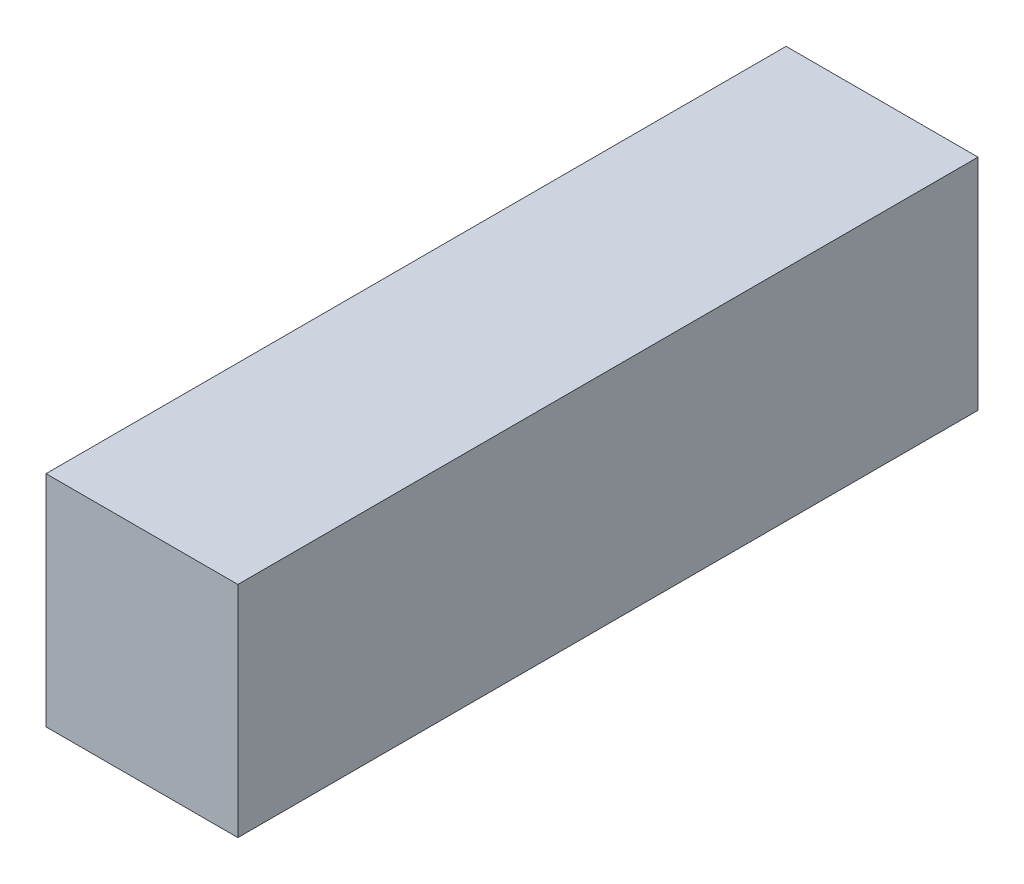
ISO-10303-21;
HEADER;
FILE_DESCRIPTION(('STEP AP214'),'2;1');
FILE_NAME('part.step','',(''),(''),'','','');
FILE_SCHEMA(('AUTOMOTIVE_DESIGN { 1 0 10303 214 1 1 1 1 }'));
ENDSEC;
DATA;
#1=APPLICATION_CONTEXT('core data for automotive mechanical design processes');
#2=APPLICATION_PROTOCOL_DEFINITION('international standard','automotive_design',2000,#1);
#3=PRODUCT_CONTEXT('',#1,'mechanical');
#4=PRODUCT('Part','Part','',(#3));
#5=PRODUCT_RELATED_PRODUCT_CATEGORY('part','',(#4));
#6=PRODUCT_DEFINITION_FORMATION('','',#4);
#7=PRODUCT_DEFINITION_CONTEXT('part definition',#1,'design');
#8=PRODUCT_DEFINITION('design','',#6,#7);
#9=PRODUCT_DEFINITION_SHAPE('','',#8);
#10=(LENGTH_UNIT() NAMED_UNIT(*) SI_UNIT(.MILLI.,.METRE.));
#11=(NAMED_UNIT(*) PLANE_ANGLE_UNIT() SI_UNIT($,.RADIAN.));
#12=(NAMED_UNIT(*) SI_UNIT($,.STERADIAN.) SOLID_ANGLE_UNIT());
#13=UNCERTAINTY_MEASURE_WITH_UNIT(LENGTH_MEASURE(1.E-05),#10,'distance_accuracy_value','');
#14=(GEOMETRIC_REPRESENTATION_CONTEXT(3) GLOBAL_UNCERTAINTY_ASSIGNED_CONTEXT((#13)) GLOBAL_UNIT_ASSIGNED_CONTEXT((#10,
#11,#12)) REPRESENTATION_CONTEXT('',''));
#15=CARTESIAN_POINT('',(0.,0.,0.));
#16=DIRECTION('',(0.,0.,1.));
#17=DIRECTION('',(1.,0.,0.));
#18=AXIS2_PLACEMENT_3D('',#15,#16,#17);
#19=CARTESIAN_POINT('',(8.5,-4.,-75.6));
#20=DIRECTION('',(0.,0.,1.));
#21=DIRECTION('',(1.,0.,0.));
#22=AXIS2_PLACEMENT_3D('',#19,#20,#21);
#23=PLANE('',#22);
#24=DIRECTION('',(0.,1.,0.));
#25=VECTOR('',#24,1.);
#26=CARTESIAN_POINT('',(8.5,-4.,-75.6));
#27=LINE('',#26,#25);
#28=CARTESIAN_POINT('',(8.5,-4.,-75.6));
#29=VERTEX_POINT('',#28);
#30=CARTESIAN_POINT('',(8.5,4.,-75.6));
#31=VERTEX_POINT('',#30);
#32=EDGE_CURVE('E87',#29,#31,#27,.T.);
#33=ORIENTED_EDGE('',*,*,#32,.F.);
#34=DIRECTION('',(1.,0.,0.));
#35=VECTOR('',#34,1.);
#36=CARTESIAN_POINT('',(8.5,-4.,-75.6));
#37=LINE('',#36,#35);
#38=CARTESIAN_POINT('',(15.5,-4.,-75.6));
#39=VERTEX_POINT('',#38);
#40=EDGE_CURVE('E67',#29,#39,#37,.T.);
#41=ORIENTED_EDGE('',*,*,#40,.T.);
#42=DIRECTION('',(0.,1.,0.));
#43=VECTOR('',#42,1.);
#44=CARTESIAN_POINT('',(15.5,-4.,-75.6));
#45=LINE('',#44,#43);
#46=CARTESIAN_POINT('',(15.5,4.,-75.6));
#47=VERTEX_POINT('',#46);
#48=EDGE_CURVE('E81',#39,#47,#45,.T.);
#49=ORIENTED_EDGE('',*,*,#48,.T.);
#50=DIRECTION('',(1.,0.,0.));
#51=VECTOR('',#50,1.);
#52=CARTESIAN_POINT('',(8.5,4.,-75.6));
#53=LINE('',#52,#51);
#54=EDGE_CURVE('E9',#31,#47,#53,.T.);
#55=ORIENTED_EDGE('',*,*,#54,.F.);
#56=EDGE_LOOP('',(#33,#41,#49,#55));
#57=FACE_BOUND('',#56,.T.);
#58=ADVANCED_FACE('F15',(#57),#23,.T.);
#59=CARTESIAN_POINT('',(8.5,-4.,-102.6));
#60=DIRECTION('',(0.,0.,1.));
#61=DIRECTION('',(1.,0.,0.));
#62=AXIS2_PLACEMENT_3D('',#59,#60,#61);
#63=PLANE('',#62);
#64=DIRECTION('',(1.,0.,0.));
#65=VECTOR('',#64,1.);
#66=CARTESIAN_POINT('',(8.5,4.,-102.6));
#67=LINE('',#66,#65);
#68=CARTESIAN_POINT('',(8.5,4.,-102.6));
#69=VERTEX_POINT('',#68);
#70=CARTESIAN_POINT('',(15.5,4.,-102.6));
#71=VERTEX_POINT('',#70);
#72=EDGE_CURVE('E18',#69,#71,#67,.T.);
#73=ORIENTED_EDGE('',*,*,#72,.T.);
#74=DIRECTION('',(0.,1.,0.));
#75=VECTOR('',#74,1.);
#76=CARTESIAN_POINT('',(15.5,-4.,-102.6));
#77=LINE('',#76,#75);
#78=CARTESIAN_POINT('',(15.5,-4.,-102.6));
#79=VERTEX_POINT('',#78);
#80=EDGE_CURVE('E105',#79,#71,#77,.T.);
#81=ORIENTED_EDGE('',*,*,#80,.F.);
#82=DIRECTION('',(1.,0.,0.));
#83=VECTOR('',#82,1.);
#84=CARTESIAN_POINT('',(8.5,-4.,-102.6));
#85=LINE('',#84,#83);
#86=CARTESIAN_POINT('',(8.5,-4.,-102.6));
#87=VERTEX_POINT('',#86);
#88=EDGE_CURVE('E79',#87,#79,#85,.T.);
#89=ORIENTED_EDGE('',*,*,#88,.F.);
#90=DIRECTION('',(0.,1.,0.));
#91=VECTOR('',#90,1.);
#92=CARTESIAN_POINT('',(8.5,-4.,-102.6));
#93=LINE('',#92,#91);
#94=EDGE_CURVE('E86',#87,#69,#93,.T.);
#95=ORIENTED_EDGE('',*,*,#94,.T.);
#96=EDGE_LOOP('',(#73,#81,#89,#95));
#97=FACE_BOUND('',#96,.T.);
#98=ADVANCED_FACE('F128',(#97),#63,.F.);
#99=CARTESIAN_POINT('',(8.5,4.,-102.6));
#100=DIRECTION('',(0.,1.,0.));
#101=DIRECTION('',(1.,0.,0.));
#102=AXIS2_PLACEMENT_3D('',#99,#100,#101);
#103=PLANE('',#102);
#104=ORIENTED_EDGE('',*,*,#72,.F.);
#105=DIRECTION('',(0.,0.,1.));
#106=VECTOR('',#105,1.);
#107=CARTESIAN_POINT('',(8.5,4.,-102.6));
#108=LINE('',#107,#106);
#109=EDGE_CURVE('E95',#69,#31,#108,.T.);
#110=ORIENTED_EDGE('',*,*,#109,.T.);
#111=ORIENTED_EDGE('',*,*,#54,.T.);
#112=DIRECTION('',(0.,0.,1.));
#113=VECTOR('',#112,1.);
#114=CARTESIAN_POINT('',(15.5,4.,-102.6));
#115=LINE('',#114,#113);
#116=EDGE_CURVE('E106',#71,#47,#115,.T.);
#117=ORIENTED_EDGE('',*,*,#116,.F.);
#118=EDGE_LOOP('',(#104,#110,#111,#117));
#119=FACE_BOUND('',#118,.T.);
#120=ADVANCED_FACE('F132',(#119),#103,.T.);
#121=CARTESIAN_POINT('',(8.5,-4.,-102.6));
#122=DIRECTION('',(0.,1.,0.));
#123=DIRECTION('',(1.,0.,0.));
#124=AXIS2_PLACEMENT_3D('',#121,#122,#123);
#125=PLANE('',#124);
#126=DIRECTION('',(0.,0.,1.));
#127=VECTOR('',#126,1.);
#128=CARTESIAN_POINT('',(15.5,-4.,-102.6));
#129=LINE('',#128,#127);
#130=EDGE_CURVE('E74',#79,#39,#129,.T.);
#131=ORIENTED_EDGE('',*,*,#130,.T.);
#132=ORIENTED_EDGE('',*,*,#40,.F.);
#133=DIRECTION('',(0.,0.,1.));
#134=VECTOR('',#133,1.);
#135=CARTESIAN_POINT('',(8.5,-4.,-102.6));
#136=LINE('',#135,#134);
#137=EDGE_CURVE('E71',#87,#29,#136,.T.);
#138=ORIENTED_EDGE('',*,*,#137,.F.);
#139=ORIENTED_EDGE('',*,*,#88,.T.);
#140=EDGE_LOOP('',(#131,#132,#138,#139));
#141=FACE_BOUND('',#140,.T.);
#142=ADVANCED_FACE('F75',(#141),#125,.F.);
#143=CARTESIAN_POINT('',(15.5,-4.,-102.6));
#144=DIRECTION('',(1.,0.,0.));
#145=DIRECTION('',(0.,1.,0.));
#146=AXIS2_PLACEMENT_3D('',#143,#144,#145);
#147=PLANE('',#146);
#148=ORIENTED_EDGE('',*,*,#130,.F.);
#149=ORIENTED_EDGE('',*,*,#80,.T.);
#150=ORIENTED_EDGE('',*,*,#116,.T.);
#151=ORIENTED_EDGE('',*,*,#48,.F.);
#152=EDGE_LOOP('',(#148,#149,#150,#151));
#153=FACE_BOUND('',#152,.T.);
#154=ADVANCED_FACE('F125',(#153),#147,.T.);
#155=CARTESIAN_POINT('',(8.5,-4.,-102.6));
#156=DIRECTION('',(1.,0.,0.));
#157=DIRECTION('',(0.,1.,0.));
#158=AXIS2_PLACEMENT_3D('',#155,#156,#157);
#159=PLANE('',#158);
#160=ORIENTED_EDGE('',*,*,#32,.T.);
#161=ORIENTED_EDGE('',*,*,#109,.F.);
#162=ORIENTED_EDGE('',*,*,#94,.F.);
#163=ORIENTED_EDGE('',*,*,#137,.T.);
#164=EDGE_LOOP('',(#160,#161,#162,#163));
#165=FACE_BOUND('',#164,.T.);
#166=ADVANCED_FACE('F84',(#165),#159,.F.);
#167=CLOSED_SHELL('',(#58,#98,#120,#142,#154,#166));
#168=MANIFOLD_SOLID_BREP('B1',#167);
#169=ADVANCED_BREP_SHAPE_REPRESENTATION('',(#18,#168),#14);
#170=SHAPE_DEFINITION_REPRESENTATION(#9,#169);
ENDSEC;
END-ISO-10303-21;
